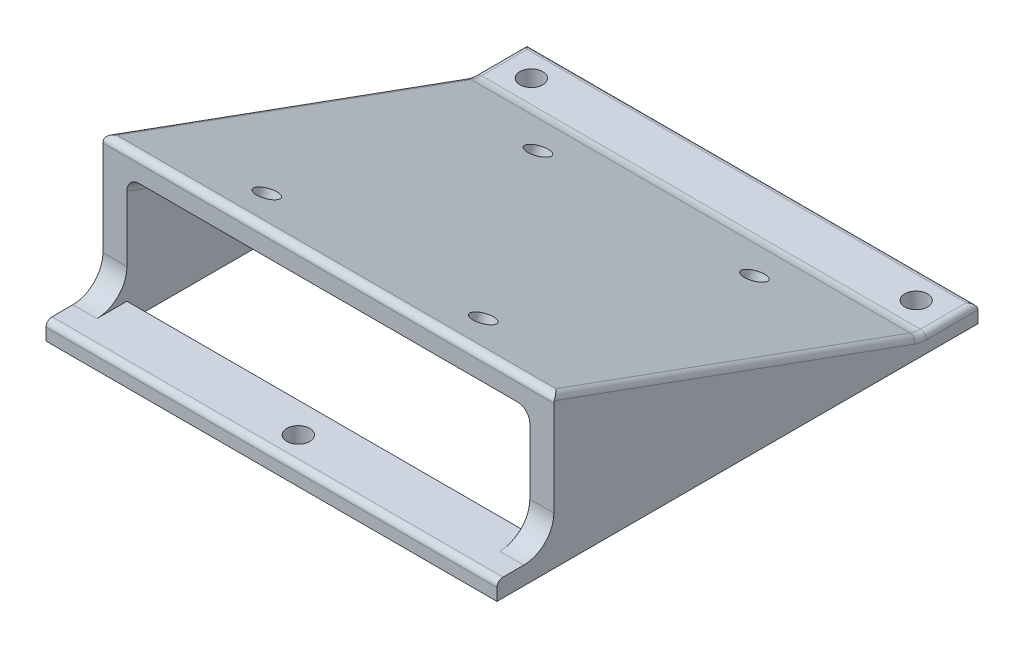
ISO-10303-21;
HEADER;
FILE_DESCRIPTION(('STEP AP214'),'2;1');
FILE_NAME('part.step','',(''),(''),'','','');
FILE_SCHEMA(('AUTOMOTIVE_DESIGN { 1 0 10303 214 1 1 1 1 }'));
ENDSEC;
DATA;
#1=APPLICATION_CONTEXT('core data for automotive mechanical design processes');
#2=APPLICATION_PROTOCOL_DEFINITION('international standard','automotive_design',2000,#1);
#3=PRODUCT_CONTEXT('',#1,'mechanical');
#4=PRODUCT('Part','Part','',(#3));
#5=PRODUCT_RELATED_PRODUCT_CATEGORY('part','',(#4));
#6=PRODUCT_DEFINITION_FORMATION('','',#4);
#7=PRODUCT_DEFINITION_CONTEXT('part definition',#1,'design');
#8=PRODUCT_DEFINITION('design','',#6,#7);
#9=PRODUCT_DEFINITION_SHAPE('','',#8);
#10=(LENGTH_UNIT() NAMED_UNIT(*) SI_UNIT(.MILLI.,.METRE.));
#11=(NAMED_UNIT(*) PLANE_ANGLE_UNIT() SI_UNIT($,.RADIAN.));
#12=(NAMED_UNIT(*) SI_UNIT($,.STERADIAN.) SOLID_ANGLE_UNIT());
#13=UNCERTAINTY_MEASURE_WITH_UNIT(LENGTH_MEASURE(1.E-05),#10,'distance_accuracy_value','');
#14=(GEOMETRIC_REPRESENTATION_CONTEXT(3) GLOBAL_UNCERTAINTY_ASSIGNED_CONTEXT((#13)) GLOBAL_UNIT_ASSIGNED_CONTEXT((#10,
#11,#12)) REPRESENTATION_CONTEXT('',''));
#15=CARTESIAN_POINT('',(0.,0.,0.));
#16=DIRECTION('',(0.,0.,1.));
#17=DIRECTION('',(1.,0.,0.));
#18=AXIS2_PLACEMENT_3D('',#15,#16,#17);
#19=CARTESIAN_POINT('',(37.5,0.,80.));
#20=DIRECTION('',(0.,0.,1.));
#21=DIRECTION('',(1.,0.,0.));
#22=AXIS2_PLACEMENT_3D('',#19,#20,#21);
#23=PLANE('',#22);
#24=DIRECTION('',(0.,1.,0.));
#25=VECTOR('',#24,1.);
#26=CARTESIAN_POINT('',(-37.5,0.,80.));
#27=LINE('',#26,#25);
#28=CARTESIAN_POINT('',(-37.5,27.,80.));
#29=VERTEX_POINT('',#28);
#30=CARTESIAN_POINT('',(-37.5,29.,80.));
#31=VERTEX_POINT('',#30);
#32=EDGE_CURVE('E238',#29,#31,#27,.T.);
#33=ORIENTED_EDGE('',*,*,#32,.F.);
#34=DIRECTION('',(1.,0.,0.));
#35=VECTOR('',#34,1.);
#36=CARTESIAN_POINT('',(-37.5,27.,80.));
#37=LINE('',#36,#35);
#38=CARTESIAN_POINT('',(37.5,27.,80.));
#39=VERTEX_POINT('',#38);
#40=EDGE_CURVE('E64',#29,#39,#37,.T.);
#41=ORIENTED_EDGE('',*,*,#40,.T.);
#42=DIRECTION('',(0.,1.,0.));
#43=VECTOR('',#42,1.);
#44=CARTESIAN_POINT('',(37.5,0.,80.));
#45=LINE('',#44,#43);
#46=CARTESIAN_POINT('',(37.5,29.,80.));
#47=VERTEX_POINT('',#46);
#48=EDGE_CURVE('E216',#39,#47,#45,.T.);
#49=ORIENTED_EDGE('',*,*,#48,.T.);
#50=DIRECTION('',(-1.,0.,0.));
#51=VECTOR('',#50,1.);
#52=CARTESIAN_POINT('',(-37.5,29.,80.));
#53=LINE('',#52,#51);
#54=EDGE_CURVE('E329',#47,#31,#53,.T.);
#55=ORIENTED_EDGE('',*,*,#54,.T.);
#56=EDGE_LOOP('',(#33,#41,#49,#55));
#57=FACE_BOUND('',#56,.T.);
#58=ADVANCED_FACE('F49',(#57),#23,.T.);
#59=CARTESIAN_POINT('',(37.5,0.,0.));
#60=DIRECTION('',(0.,0.,1.));
#61=DIRECTION('',(1.,0.,0.));
#62=AXIS2_PLACEMENT_3D('',#59,#60,#61);
#63=PLANE('',#62);
#64=DIRECTION('',(1.,0.,0.));
#65=VECTOR('',#64,1.);
#66=CARTESIAN_POINT('',(-37.5,27.,0.));
#67=LINE('',#66,#65);
#68=CARTESIAN_POINT('',(-37.5,27.,0.));
#69=VERTEX_POINT('',#68);
#70=CARTESIAN_POINT('',(37.5,27.,0.));
#71=VERTEX_POINT('',#70);
#72=EDGE_CURVE('E201',#69,#71,#67,.T.);
#73=ORIENTED_EDGE('',*,*,#72,.F.);
#74=DIRECTION('',(0.,1.,0.));
#75=VECTOR('',#74,1.);
#76=CARTESIAN_POINT('',(-37.5,0.,0.));
#77=LINE('',#76,#75);
#78=CARTESIAN_POINT('',(-37.5,29.,0.));
#79=VERTEX_POINT('',#78);
#80=EDGE_CURVE('E240',#69,#79,#77,.T.);
#81=ORIENTED_EDGE('',*,*,#80,.T.);
#82=DIRECTION('',(-1.,0.,0.));
#83=VECTOR('',#82,1.);
#84=CARTESIAN_POINT('',(37.5,29.,0.));
#85=LINE('',#84,#83);
#86=CARTESIAN_POINT('',(37.5,29.,0.));
#87=VERTEX_POINT('',#86);
#88=EDGE_CURVE('E221',#79,#87,#85,.F.);
#89=ORIENTED_EDGE('',*,*,#88,.T.);
#90=DIRECTION('',(0.,1.,0.));
#91=VECTOR('',#90,1.);
#92=CARTESIAN_POINT('',(37.5,0.,0.));
#93=LINE('',#92,#91);
#94=EDGE_CURVE('E213',#71,#87,#93,.T.);
#95=ORIENTED_EDGE('',*,*,#94,.F.);
#96=EDGE_LOOP('',(#73,#81,#89,#95));
#97=FACE_BOUND('',#96,.T.);
#98=ADVANCED_FACE('F219',(#97),#63,.F.);
#99=CARTESIAN_POINT('',(37.5,0.,0.));
#100=DIRECTION('',(1.,0.,0.));
#101=DIRECTION('',(0.,0.,-1.));
#102=AXIS2_PLACEMENT_3D('',#99,#100,#101);
#103=PLANE('',#102);
#104=ORIENTED_EDGE('',*,*,#48,.F.);
#105=DIRECTION('',(0.,0.,-1.));
#106=VECTOR('',#105,1.);
#107=CARTESIAN_POINT('',(37.5,27.,0.));
#108=LINE('',#107,#106);
#109=EDGE_CURVE('E204',#39,#71,#108,.T.);
#110=ORIENTED_EDGE('',*,*,#109,.T.);
#111=ORIENTED_EDGE('',*,*,#94,.T.);
#112=DIRECTION('',(0.,0.,1.));
#113=VECTOR('',#112,1.);
#114=CARTESIAN_POINT('',(37.5,29.,8.57835492091559));
#115=LINE('',#114,#113);
#116=CARTESIAN_POINT('',(37.5,29.,8.57835492091559));
#117=VERTEX_POINT('',#116);
#118=EDGE_CURVE('E319',#87,#117,#115,.T.);
#119=ORIENTED_EDGE('',*,*,#118,.T.);
#120=CARTESIAN_POINT('',(37.5,35.,8.57835492091559));
#121=DIRECTION('',(1.,0.,0.));
#122=DIRECTION('',(0.,0.,-1.));
#123=AXIS2_PLACEMENT_3D('',#120,#121,#122);
#124=CIRCLE('',#123,6.);
#125=CARTESIAN_POINT('',(37.5,29.3618442752845,10.6304757808696));
#126=VERTEX_POINT('',#125);
#127=EDGE_CURVE('E317',#117,#126,#124,.F.);
#128=ORIENTED_EDGE('',*,*,#127,.T.);
#129=DIRECTION('',(0.,-0.342020143325663,-0.939692620785911));
#130=VECTOR('',#129,1.);
#131=CARTESIAN_POINT('',(37.5,22.5105919025378,-8.1931854082374));
#132=LINE('',#131,#130);
#133=CARTESIAN_POINT('',(37.5,51.1451814527517,70.479702796328));
#134=VERTEX_POINT('',#133);
#135=EDGE_CURVE('E313',#126,#134,#132,.F.);
#136=ORIENTED_EDGE('',*,*,#135,.T.);
#137=CARTESIAN_POINT('',(37.5,50.803161309426,69.5400101755421));
#138=DIRECTION('',(1.,0.,0.));
#139=DIRECTION('',(0.,0.,-1.));
#140=AXIS2_PLACEMENT_3D('',#137,#138,#139);
#141=CIRCLE('',#140,1.);
#142=CARTESIAN_POINT('',(37.5,50.803161309426,70.5400101755421));
#143=VERTEX_POINT('',#142);
#144=EDGE_CURVE('E315',#134,#143,#141,.T.);
#145=ORIENTED_EDGE('',*,*,#144,.T.);
#146=DIRECTION('',(0.,-1.,0.));
#147=VECTOR('',#146,1.);
#148=CARTESIAN_POINT('',(37.5,0.,70.5400101755421));
#149=LINE('',#148,#147);
#150=CARTESIAN_POINT('',(37.5,35.,70.5400101755421));
#151=VERTEX_POINT('',#150);
#152=EDGE_CURVE('E241',#143,#151,#149,.T.);
#153=ORIENTED_EDGE('',*,*,#152,.T.);
#154=CARTESIAN_POINT('',(37.5,35.,75.5400101755421));
#155=DIRECTION('',(1.,0.,0.));
#156=DIRECTION('',(0.,0.,-1.));
#157=AXIS2_PLACEMENT_3D('',#154,#155,#156);
#158=CIRCLE('',#157,5.);
#159=CARTESIAN_POINT('',(37.5,30.,75.5400101755421));
#160=VERTEX_POINT('',#159);
#161=EDGE_CURVE('E268',#151,#160,#158,.F.);
#162=ORIENTED_EDGE('',*,*,#161,.T.);
#163=DIRECTION('',(0.,0.,1.));
#164=VECTOR('',#163,1.);
#165=CARTESIAN_POINT('',(37.5,30.,0.));
#166=LINE('',#165,#164);
#167=CARTESIAN_POINT('',(37.5,30.,79.));
#168=VERTEX_POINT('',#167);
#169=EDGE_CURVE('E228',#160,#168,#166,.T.);
#170=ORIENTED_EDGE('',*,*,#169,.T.);
#171=CARTESIAN_POINT('',(37.5,29.,79.));
#172=DIRECTION('',(1.,0.,0.));
#173=DIRECTION('',(0.,0.,-1.));
#174=AXIS2_PLACEMENT_3D('',#171,#172,#173);
#175=CIRCLE('',#174,1.);
#176=EDGE_CURVE('E311',#168,#47,#175,.T.);
#177=ORIENTED_EDGE('',*,*,#176,.T.);
#178=EDGE_LOOP('',(#104,#110,#111,#119,#128,#136,#145,#153,#162,#170,#177));
#179=FACE_BOUND('',#178,.T.);
#180=ADVANCED_FACE('F212',(#179),#103,.T.);
#181=CARTESIAN_POINT('',(-37.5,0.,0.));
#182=DIRECTION('',(1.,0.,0.));
#183=DIRECTION('',(0.,0.,-1.));
#184=AXIS2_PLACEMENT_3D('',#181,#182,#183);
#185=PLANE('',#184);
#186=DIRECTION('',(0.,0.,-1.));
#187=VECTOR('',#186,1.);
#188=CARTESIAN_POINT('',(-37.5,27.,0.));
#189=LINE('',#188,#187);
#190=EDGE_CURVE('E205',#29,#69,#189,.T.);
#191=ORIENTED_EDGE('',*,*,#190,.F.);
#192=ORIENTED_EDGE('',*,*,#32,.T.);
#193=CARTESIAN_POINT('',(-37.5,29.,79.));
#194=DIRECTION('',(1.,0.,0.));
#195=DIRECTION('',(0.,0.,-1.));
#196=AXIS2_PLACEMENT_3D('',#193,#194,#195);
#197=CIRCLE('',#196,1.);
#198=CARTESIAN_POINT('',(-37.5,30.,79.));
#199=VERTEX_POINT('',#198);
#200=EDGE_CURVE('E296',#31,#199,#197,.F.);
#201=ORIENTED_EDGE('',*,*,#200,.T.);
#202=DIRECTION('',(0.,0.,1.));
#203=VECTOR('',#202,1.);
#204=CARTESIAN_POINT('',(-37.5,30.,0.));
#205=LINE('',#204,#203);
#206=CARTESIAN_POINT('',(-37.5,30.,75.5400101755421));
#207=VERTEX_POINT('',#206);
#208=EDGE_CURVE('E234',#207,#199,#205,.T.);
#209=ORIENTED_EDGE('',*,*,#208,.F.);
#210=CARTESIAN_POINT('',(-37.5,35.,75.5400101755421));
#211=DIRECTION('',(1.,0.,0.));
#212=DIRECTION('',(0.,0.,-1.));
#213=AXIS2_PLACEMENT_3D('',#210,#211,#212);
#214=CIRCLE('',#213,5.);
#215=CARTESIAN_POINT('',(-37.5,35.,70.5400101755421));
#216=VERTEX_POINT('',#215);
#217=EDGE_CURVE('E270',#207,#216,#214,.T.);
#218=ORIENTED_EDGE('',*,*,#217,.T.);
#219=DIRECTION('',(0.,-1.,0.));
#220=VECTOR('',#219,1.);
#221=CARTESIAN_POINT('',(-37.5,0.,70.5400101755421));
#222=LINE('',#221,#220);
#223=CARTESIAN_POINT('',(-37.5,50.803161309426,70.5400101755421));
#224=VERTEX_POINT('',#223);
#225=EDGE_CURVE('E232',#224,#216,#222,.T.);
#226=ORIENTED_EDGE('',*,*,#225,.F.);
#227=CARTESIAN_POINT('',(-37.5,50.803161309426,69.5400101755421));
#228=DIRECTION('',(1.,0.,0.));
#229=DIRECTION('',(0.,0.,-1.));
#230=AXIS2_PLACEMENT_3D('',#227,#228,#229);
#231=CIRCLE('',#230,1.);
#232=CARTESIAN_POINT('',(-37.5,51.1451814527517,70.479702796328));
#233=VERTEX_POINT('',#232);
#234=EDGE_CURVE('E298',#224,#233,#231,.F.);
#235=ORIENTED_EDGE('',*,*,#234,.T.);
#236=DIRECTION('',(0.,-0.342020143325663,-0.939692620785911));
#237=VECTOR('',#236,1.);
#238=CARTESIAN_POINT('',(-37.5,29.3618442752845,10.6304757808696));
#239=LINE('',#238,#237);
#240=CARTESIAN_POINT('',(-37.5,29.3618442752845,10.6304757808696));
#241=VERTEX_POINT('',#240);
#242=EDGE_CURVE('E300',#233,#241,#239,.T.);
#243=ORIENTED_EDGE('',*,*,#242,.T.);
#244=CARTESIAN_POINT('',(-37.5,35.,8.57835492091559));
#245=DIRECTION('',(1.,0.,0.));
#246=DIRECTION('',(0.,0.,-1.));
#247=AXIS2_PLACEMENT_3D('',#244,#245,#246);
#248=CIRCLE('',#247,6.);
#249=CARTESIAN_POINT('',(-37.5,29.,8.57835492091559));
#250=VERTEX_POINT('',#249);
#251=EDGE_CURVE('E302',#241,#250,#248,.T.);
#252=ORIENTED_EDGE('',*,*,#251,.T.);
#253=DIRECTION('',(0.,0.,1.));
#254=VECTOR('',#253,1.);
#255=CARTESIAN_POINT('',(-37.5,29.,0.));
#256=LINE('',#255,#254);
#257=EDGE_CURVE('E304',#250,#79,#256,.F.);
#258=ORIENTED_EDGE('',*,*,#257,.T.);
#259=ORIENTED_EDGE('',*,*,#80,.F.);
#260=EDGE_LOOP('',(#191,#192,#201,#209,#218,#226,#235,#243,#252,#258,#259));
#261=FACE_BOUND('',#260,.T.);
#262=ADVANCED_FACE('F489',(#261),#185,.F.);
#263=CARTESIAN_POINT('',(37.5,0.,70.5400101755421));
#264=DIRECTION('',(0.,0.,-1.));
#265=DIRECTION('',(-1.,0.,0.));
#266=AXIS2_PLACEMENT_3D('',#263,#264,#265);
#267=PLANE('',#266);
#268=DIRECTION('',(0.,-1.,0.));
#269=VECTOR('',#268,1.);
#270=CARTESIAN_POINT('',(33.5,0.,70.5400101755421));
#271=LINE('',#270,#269);
#272=CARTESIAN_POINT('',(33.5,30.,70.5400101755421));
#273=VERTEX_POINT('',#272);
#274=CARTESIAN_POINT('',(33.5,27.,70.5400101755421));
#275=VERTEX_POINT('',#274);
#276=EDGE_CURVE('E392',#273,#275,#271,.T.);
#277=ORIENTED_EDGE('',*,*,#276,.T.);
#278=DIRECTION('',(-1.,0.,0.));
#279=VECTOR('',#278,1.);
#280=CARTESIAN_POINT('',(37.5,27.,70.5400101755421));
#281=LINE('',#280,#279);
#282=CARTESIAN_POINT('',(-33.5,27.,70.5400101755421));
#283=VERTEX_POINT('',#282);
#284=EDGE_CURVE('E409',#275,#283,#281,.T.);
#285=ORIENTED_EDGE('',*,*,#284,.T.);
#286=DIRECTION('',(0.,-1.,0.));
#287=VECTOR('',#286,1.);
#288=CARTESIAN_POINT('',(-33.5,0.,70.5400101755421));
#289=LINE('',#288,#287);
#290=CARTESIAN_POINT('',(-33.5,30.,70.5400101755421));
#291=VERTEX_POINT('',#290);
#292=EDGE_CURVE('E358',#291,#283,#289,.T.);
#293=ORIENTED_EDGE('',*,*,#292,.F.);
#294=DIRECTION('',(-1.,0.,0.));
#295=VECTOR('',#294,1.);
#296=CARTESIAN_POINT('',(37.5,30.,70.5400101755421));
#297=LINE('',#296,#295);
#298=EDGE_CURVE('E223',#273,#291,#297,.T.);
#299=ORIENTED_EDGE('',*,*,#298,.F.);
#300=EDGE_LOOP('',(#277,#285,#293,#299));
#301=FACE_BOUND('',#300,.T.);
#302=ADVANCED_FACE('F457',(#301),#267,.T.);
#303=CARTESIAN_POINT('',(37.5,19.69151404018,-7.16712497826041));
#304=DIRECTION('',(0.,0.939692620785911,-0.342020143325663));
#305=DIRECTION('',(0.,0.342020143325663,0.939692620785911));
#306=AXIS2_PLACEMENT_3D('',#303,#304,#305);
#307=PLANE('',#306);
#308=CARTESIAN_POINT('',(18.0000000001173,45.6511059144536,64.1562675145651));
#309=DIRECTION('',(0.,-0.93969262078591,0.342020143325663));
#310=DIRECTION('',(0.,-0.342020143325663,-0.93969262078591));
#311=AXIS2_PLACEMENT_3D('',#308,#309,#310);
#312=CIRCLE('',#311,1.8);
#313=CARTESIAN_POINT('',(18.0000000001173,45.0354696564674,62.4648207971504));
#314=VERTEX_POINT('',#313);
#315=EDGE_CURVE('E431',#314,#314,#312,.T.);
#316=ORIENTED_EDGE('',*,*,#315,.F.);
#317=EDGE_LOOP('',(#316));
#318=FACE_BOUND('',#317,.T.);
#319=CARTESIAN_POINT('',(-17.9999999998827,29.2341390348217,19.0510217168414));
#320=DIRECTION('',(0.,-0.93969262078591,0.342020143325663));
#321=DIRECTION('',(0.,-0.342020143325663,-0.93969262078591));
#322=AXIS2_PLACEMENT_3D('',#319,#320,#321);
#323=CIRCLE('',#322,1.8);
#324=CARTESIAN_POINT('',(-17.9999999998827,28.6185027768355,17.3595749994267));
#325=VERTEX_POINT('',#324);
#326=EDGE_CURVE('E424',#325,#325,#323,.T.);
#327=ORIENTED_EDGE('',*,*,#326,.F.);
#328=EDGE_LOOP('',(#327));
#329=FACE_BOUND('',#328,.T.);
#330=CARTESIAN_POINT('',(18.0000000001173,29.2341390348217,19.0510217168414));
#331=DIRECTION('',(0.,-0.93969262078591,0.342020143325663));
#332=DIRECTION('',(0.,-0.342020143325663,-0.93969262078591));
#333=AXIS2_PLACEMENT_3D('',#330,#331,#332);
#334=CIRCLE('',#333,1.8);
#335=CARTESIAN_POINT('',(18.0000000001173,28.6185027768355,17.3595749994267));
#336=VERTEX_POINT('',#335);
#337=EDGE_CURVE('E436',#336,#336,#334,.T.);
#338=ORIENTED_EDGE('',*,*,#337,.F.);
#339=EDGE_LOOP('',(#338));
#340=FACE_BOUND('',#339,.T.);
#341=CARTESIAN_POINT('',(-17.9999999998827,45.6511059144536,64.1562675145651));
#342=DIRECTION('',(0.,-0.93969262078591,0.342020143325663));
#343=DIRECTION('',(0.,-0.342020143325663,-0.93969262078591));
#344=AXIS2_PLACEMENT_3D('',#341,#342,#343);
#345=CIRCLE('',#344,1.8);
#346=CARTESIAN_POINT('',(-17.9999999998827,45.0354696564674,62.4648207971504));
#347=VERTEX_POINT('',#346);
#348=EDGE_CURVE('E217',#347,#347,#345,.T.);
#349=ORIENTED_EDGE('',*,*,#348,.F.);
#350=EDGE_LOOP('',(#349));
#351=FACE_BOUND('',#350,.T.);
#352=DIRECTION('',(-1.,0.,0.));
#353=VECTOR('',#352,1.);
#354=CARTESIAN_POINT('',(37.5,27.,12.9127751667464));
#355=LINE('',#354,#353);
#356=CARTESIAN_POINT('',(31.5,27.,12.9127751667464));
#357=VERTEX_POINT('',#356);
#358=CARTESIAN_POINT('',(-31.5,27.,12.9127751667464));
#359=VERTEX_POINT('',#358);
#360=EDGE_CURVE('E71',#357,#359,#355,.T.);
#361=ORIENTED_EDGE('',*,*,#360,.F.);
#362=DIRECTION('',(0.,-0.342020143325663,-0.939692620785911));
#363=VECTOR('',#362,1.);
#364=CARTESIAN_POINT('',(31.5,47.9745982262645,70.5400101755421));
#365=LINE('',#364,#363);
#366=CARTESIAN_POINT('',(31.5,47.9745982262645,70.5400101755421));
#367=VERTEX_POINT('',#366);
#368=EDGE_CURVE('E281',#357,#367,#365,.F.);
#369=ORIENTED_EDGE('',*,*,#368,.T.);
#370=DIRECTION('',(-1.,0.,0.));
#371=VECTOR('',#370,1.);
#372=CARTESIAN_POINT('',(37.5,47.9745982262645,70.5400101755421));
#373=LINE('',#372,#371);
#374=CARTESIAN_POINT('',(-31.5,47.9745982262645,70.5400101755421));
#375=VERTEX_POINT('',#374);
#376=EDGE_CURVE('E235',#367,#375,#373,.T.);
#377=ORIENTED_EDGE('',*,*,#376,.T.);
#378=DIRECTION('',(0.,-0.342020143325663,-0.939692620785911));
#379=VECTOR('',#378,1.);
#380=CARTESIAN_POINT('',(-31.5,19.69151404018,-7.16712497826041));
#381=LINE('',#380,#379);
#382=EDGE_CURVE('E278',#375,#359,#381,.T.);
#383=ORIENTED_EDGE('',*,*,#382,.T.);
#384=EDGE_LOOP('',(#361,#369,#377,#383));
#385=FACE_BOUND('',#384,.T.);
#386=ADVANCED_FACE('F453',(#318,#329,#340,#351,#385),#307,.F.);
#387=CARTESIAN_POINT('',(33.5,0.,0.));
#388=DIRECTION('',(1.,0.,0.));
#389=DIRECTION('',(0.,0.,-1.));
#390=AXIS2_PLACEMENT_3D('',#387,#388,#389);
#391=PLANE('',#390);
#392=DIRECTION('',(0.,0.,-1.));
#393=VECTOR('',#392,1.);
#394=CARTESIAN_POINT('',(33.5,27.,0.));
#395=LINE('',#394,#393);
#396=CARTESIAN_POINT('',(33.5,27.,18.7603839670727));
#397=VERTEX_POINT('',#396);
#398=EDGE_CURVE('E401',#275,#397,#395,.T.);
#399=ORIENTED_EDGE('',*,*,#398,.F.);
#400=ORIENTED_EDGE('',*,*,#276,.F.);
#401=DIRECTION('',(0.,0.,-1.));
#402=VECTOR('',#401,1.);
#403=CARTESIAN_POINT('',(33.5,30.,0.));
#404=LINE('',#403,#402);
#405=CARTESIAN_POINT('',(33.5,30.,75.5400101755421));
#406=VERTEX_POINT('',#405);
#407=EDGE_CURVE('E254',#406,#273,#404,.T.);
#408=ORIENTED_EDGE('',*,*,#407,.F.);
#409=CARTESIAN_POINT('',(33.5,35.,75.5400101755421));
#410=DIRECTION('',(1.,0.,0.));
#411=DIRECTION('',(0.,0.,-1.));
#412=AXIS2_PLACEMENT_3D('',#409,#410,#411);
#413=CIRCLE('',#412,5.);
#414=CARTESIAN_POINT('',(33.5,35.,70.5400101755421));
#415=VERTEX_POINT('',#414);
#416=EDGE_CURVE('E265',#406,#415,#413,.T.);
#417=ORIENTED_EDGE('',*,*,#416,.T.);
#418=CARTESIAN_POINT('',(33.5,45.8462426813126,70.5400101755421));
#419=VERTEX_POINT('',#418);
#420=EDGE_CURVE('E395',#419,#415,#271,.T.);
#421=ORIENTED_EDGE('',*,*,#420,.F.);
#422=DIRECTION('',(0.,-0.342020143325663,-0.939692620785911));
#423=VECTOR('',#422,1.);
#424=CARTESIAN_POINT('',(33.5,22.6045703615579,6.68404028665133));
#425=LINE('',#424,#423);
#426=EDGE_CURVE('E275',#419,#397,#425,.T.);
#427=ORIENTED_EDGE('',*,*,#426,.T.);
#428=EDGE_LOOP('',(#399,#400,#408,#417,#421,#427));
#429=FACE_BOUND('',#428,.T.);
#430=ADVANCED_FACE('F456',(#429),#391,.F.);
#431=CARTESIAN_POINT('',(-33.5,0.,0.));
#432=DIRECTION('',(1.,0.,0.));
#433=DIRECTION('',(0.,0.,-1.));
#434=AXIS2_PLACEMENT_3D('',#431,#432,#433);
#435=PLANE('',#434);
#436=ORIENTED_EDGE('',*,*,#292,.T.);
#437=DIRECTION('',(0.,0.,-1.));
#438=VECTOR('',#437,1.);
#439=CARTESIAN_POINT('',(-33.5,27.,0.));
#440=LINE('',#439,#438);
#441=CARTESIAN_POINT('',(-33.5,27.,18.7603839670727));
#442=VERTEX_POINT('',#441);
#443=EDGE_CURVE('E413',#283,#442,#440,.T.);
#444=ORIENTED_EDGE('',*,*,#443,.T.);
#445=DIRECTION('',(0.,-0.342020143325663,-0.939692620785911));
#446=VECTOR('',#445,1.);
#447=CARTESIAN_POINT('',(-33.5,17.8121287986082,-6.48308469160909));
#448=LINE('',#447,#446);
#449=CARTESIAN_POINT('',(-33.5,45.8462426813126,70.5400101755421));
#450=VERTEX_POINT('',#449);
#451=EDGE_CURVE('E283',#442,#450,#448,.F.);
#452=ORIENTED_EDGE('',*,*,#451,.T.);
#453=CARTESIAN_POINT('',(-33.5,35.,70.5400101755421));
#454=VERTEX_POINT('',#453);
#455=EDGE_CURVE('E390',#450,#454,#289,.T.);
#456=ORIENTED_EDGE('',*,*,#455,.T.);
#457=CARTESIAN_POINT('',(-33.5,35.,75.5400101755421));
#458=DIRECTION('',(1.,0.,0.));
#459=DIRECTION('',(0.,0.,-1.));
#460=AXIS2_PLACEMENT_3D('',#457,#458,#459);
#461=CIRCLE('',#460,5.);
#462=CARTESIAN_POINT('',(-33.5,30.,75.5400101755421));
#463=VERTEX_POINT('',#462);
#464=EDGE_CURVE('E273',#454,#463,#461,.F.);
#465=ORIENTED_EDGE('',*,*,#464,.T.);
#466=DIRECTION('',(0.,0.,1.));
#467=VECTOR('',#466,1.);
#468=CARTESIAN_POINT('',(-33.5,30.,0.));
#469=LINE('',#468,#467);
#470=EDGE_CURVE('E248',#291,#463,#469,.T.);
#471=ORIENTED_EDGE('',*,*,#470,.F.);
#472=EDGE_LOOP('',(#436,#444,#452,#456,#465,#471));
#473=FACE_BOUND('',#472,.T.);
#474=ADVANCED_FACE('F499',(#473),#435,.T.);
#475=CARTESIAN_POINT('',(31.5,17.8121287986082,-6.48308469160908));
#476=DIRECTION('',(0.,0.342020143325663,0.939692620785911));
#477=DIRECTION('',(0.,-0.939692620785911,0.342020143325663));
#478=AXIS2_PLACEMENT_3D('',#475,#476,#477);
#479=CYLINDRICAL_SURFACE('',#478,2.);
#480=CARTESIAN_POINT('',(31.5,27.,18.7603839670727));
#481=DIRECTION('',(0.,-1.,0.));
#482=DIRECTION('',(0.,0.,1.));
#483=AXIS2_PLACEMENT_3D('',#480,#481,#482);
#484=ELLIPSE('',#483,5.84760880032627,2.);
#485=EDGE_CURVE('E407',#397,#357,#484,.F.);
#486=ORIENTED_EDGE('',*,*,#485,.F.);
#487=ORIENTED_EDGE('',*,*,#426,.F.);
#488=CARTESIAN_POINT('',(31.5,45.8462426813126,70.5400101755421));
#489=DIRECTION('',(0.,0.,-1.));
#490=DIRECTION('',(0.,1.,0.));
#491=AXIS2_PLACEMENT_3D('',#488,#489,#490);
#492=ELLIPSE('',#491,2.12835554495182,2.);
#493=EDGE_CURVE('E285',#367,#419,#492,.T.);
#494=ORIENTED_EDGE('',*,*,#493,.F.);
#495=ORIENTED_EDGE('',*,*,#368,.F.);
#496=EDGE_LOOP('',(#486,#487,#494,#495));
#497=FACE_BOUND('',#496,.T.);
#498=ADVANCED_FACE('F468',(#497),#479,.F.);
#499=CARTESIAN_POINT('',(-31.5,17.8121287986082,-6.48308469160908));
#500=DIRECTION('',(0.,-0.342020143325663,-0.939692620785911));
#501=DIRECTION('',(0.,0.939692620785911,-0.342020143325663));
#502=AXIS2_PLACEMENT_3D('',#499,#500,#501);
#503=CYLINDRICAL_SURFACE('',#502,2.);
#504=CARTESIAN_POINT('',(-31.5,27.,18.7603839670727));
#505=DIRECTION('',(0.,-1.,0.));
#506=DIRECTION('',(0.,0.,-1.));
#507=AXIS2_PLACEMENT_3D('',#504,#505,#506);
#508=ELLIPSE('',#507,5.84760880032627,2.);
#509=EDGE_CURVE('E11',#359,#442,#508,.F.);
#510=ORIENTED_EDGE('',*,*,#509,.F.);
#511=ORIENTED_EDGE('',*,*,#382,.F.);
#512=CARTESIAN_POINT('',(-31.5,45.8462426813126,70.5400101755421));
#513=DIRECTION('',(0.,0.,-1.));
#514=DIRECTION('',(0.,-1.,0.));
#515=AXIS2_PLACEMENT_3D('',#512,#513,#514);
#516=ELLIPSE('',#515,2.12835554495182,2.);
#517=EDGE_CURVE('E287',#450,#375,#516,.T.);
#518=ORIENTED_EDGE('',*,*,#517,.F.);
#519=ORIENTED_EDGE('',*,*,#451,.F.);
#520=EDGE_LOOP('',(#510,#511,#518,#519));
#521=FACE_BOUND('',#520,.T.);
#522=ADVANCED_FACE('F506',(#521),#503,.F.);
#523=CARTESIAN_POINT('',(37.5,0.,70.5400101755421));
#524=DIRECTION('',(0.,0.,-1.));
#525=DIRECTION('',(-1.,0.,0.));
#526=AXIS2_PLACEMENT_3D('',#523,#524,#525);
#527=PLANE('',#526);
#528=ORIENTED_EDGE('',*,*,#152,.F.);
#529=DIRECTION('',(-1.,0.,0.));
#530=VECTOR('',#529,1.);
#531=CARTESIAN_POINT('',(-37.5,50.803161309426,70.5400101755421));
#532=LINE('',#531,#530);
#533=EDGE_CURVE('E327',#143,#224,#532,.T.);
#534=ORIENTED_EDGE('',*,*,#533,.T.);
#535=ORIENTED_EDGE('',*,*,#225,.T.);
#536=DIRECTION('',(-1.,0.,0.));
#537=VECTOR('',#536,1.);
#538=CARTESIAN_POINT('',(-33.5,35.,70.5400101755421));
#539=LINE('',#538,#537);
#540=EDGE_CURVE('E259',#216,#454,#539,.F.);
#541=ORIENTED_EDGE('',*,*,#540,.T.);
#542=ORIENTED_EDGE('',*,*,#455,.F.);
#543=ORIENTED_EDGE('',*,*,#517,.T.);
#544=ORIENTED_EDGE('',*,*,#376,.F.);
#545=ORIENTED_EDGE('',*,*,#493,.T.);
#546=ORIENTED_EDGE('',*,*,#420,.T.);
#547=DIRECTION('',(-1.,0.,0.));
#548=VECTOR('',#547,1.);
#549=CARTESIAN_POINT('',(37.5,35.,70.5400101755421));
#550=LINE('',#549,#548);
#551=EDGE_CURVE('E262',#415,#151,#550,.F.);
#552=ORIENTED_EDGE('',*,*,#551,.T.);
#553=EDGE_LOOP('',(#528,#534,#535,#541,#542,#543,#544,#545,#546,#552));
#554=FACE_BOUND('',#553,.T.);
#555=ADVANCED_FACE('F374',(#554),#527,.F.);
#556=CARTESIAN_POINT('',(37.5,30.,0.));
#557=DIRECTION('',(0.,-1.,0.));
#558=DIRECTION('',(0.,0.,-1.));
#559=AXIS2_PLACEMENT_3D('',#556,#557,#558);
#560=PLANE('',#559);
#561=CARTESIAN_POINT('',(0.,30.,75.5400101755421));
#562=DIRECTION('',(0.,-1.,0.));
#563=DIRECTION('',(0.,0.,-1.));
#564=AXIS2_PLACEMENT_3D('',#561,#562,#563);
#565=CIRCLE('',#564,1.9);
#566=CARTESIAN_POINT('',(0.,30.,73.6400101755421));
#567=VERTEX_POINT('',#566);
#568=EDGE_CURVE('E337',#567,#567,#565,.F.);
#569=ORIENTED_EDGE('',*,*,#568,.F.);
#570=EDGE_LOOP('',(#569));
#571=FACE_BOUND('',#570,.T.);
#572=ORIENTED_EDGE('',*,*,#208,.T.);
#573=DIRECTION('',(-1.,0.,0.));
#574=VECTOR('',#573,1.);
#575=CARTESIAN_POINT('',(37.5,30.,79.));
#576=LINE('',#575,#574);
#577=EDGE_CURVE('E57',#199,#168,#576,.F.);
#578=ORIENTED_EDGE('',*,*,#577,.T.);
#579=ORIENTED_EDGE('',*,*,#169,.F.);
#580=DIRECTION('',(-1.,0.,0.));
#581=VECTOR('',#580,1.);
#582=CARTESIAN_POINT('',(33.5,30.,75.5400101755421));
#583=LINE('',#582,#581);
#584=EDGE_CURVE('E256',#160,#406,#583,.T.);
#585=ORIENTED_EDGE('',*,*,#584,.T.);
#586=ORIENTED_EDGE('',*,*,#407,.T.);
#587=ORIENTED_EDGE('',*,*,#298,.T.);
#588=ORIENTED_EDGE('',*,*,#470,.T.);
#589=DIRECTION('',(-1.,0.,0.));
#590=VECTOR('',#589,1.);
#591=CARTESIAN_POINT('',(-37.5,30.,75.5400101755421));
#592=LINE('',#591,#590);
#593=EDGE_CURVE('E251',#463,#207,#592,.T.);
#594=ORIENTED_EDGE('',*,*,#593,.T.);
#595=EDGE_LOOP('',(#572,#578,#579,#585,#586,#587,#588,#594));
#596=FACE_BOUND('',#595,.T.);
#597=ADVANCED_FACE('F370',(#571,#596),#560,.F.);
#598=CARTESIAN_POINT('',(37.5,30.,0.));
#599=DIRECTION('',(0.,-1.,0.));
#600=DIRECTION('',(0.,0.,-1.));
#601=AXIS2_PLACEMENT_3D('',#598,#599,#600);
#602=PLANE('',#601);
#603=CARTESIAN_POINT('',(-32.,30.,4.7891774604578));
#604=DIRECTION('',(0.,-1.,0.));
#605=DIRECTION('',(0.,0.,-1.));
#606=AXIS2_PLACEMENT_3D('',#603,#604,#605);
#607=CIRCLE('',#606,1.9);
#608=CARTESIAN_POINT('',(-32.,30.,2.88917746045779));
#609=VERTEX_POINT('',#608);
#610=EDGE_CURVE('E362',#609,#609,#607,.F.);
#611=ORIENTED_EDGE('',*,*,#610,.F.);
#612=EDGE_LOOP('',(#611));
#613=FACE_BOUND('',#612,.T.);
#614=CARTESIAN_POINT('',(32.,30.,4.78917746045779));
#615=DIRECTION('',(0.,-1.,0.));
#616=DIRECTION('',(0.,0.,-1.));
#617=AXIS2_PLACEMENT_3D('',#614,#615,#616);
#618=CIRCLE('',#617,1.9);
#619=CARTESIAN_POINT('',(32.,30.,2.88917746045779));
#620=VERTEX_POINT('',#619);
#621=EDGE_CURVE('E359',#620,#620,#618,.F.);
#622=ORIENTED_EDGE('',*,*,#621,.F.);
#623=EDGE_LOOP('',(#622));
#624=FACE_BOUND('',#623,.T.);
#625=DIRECTION('',(-1.,0.,0.));
#626=VECTOR('',#625,1.);
#627=CARTESIAN_POINT('',(37.5,30.,1.));
#628=LINE('',#627,#626);
#629=CARTESIAN_POINT('',(36.5,30.,1.));
#630=VERTEX_POINT('',#629);
#631=CARTESIAN_POINT('',(-36.5,30.,1.));
#632=VERTEX_POINT('',#631);
#633=EDGE_CURVE('E289',#630,#632,#628,.T.);
#634=ORIENTED_EDGE('',*,*,#633,.T.);
#635=DIRECTION('',(0.,0.,1.));
#636=VECTOR('',#635,1.);
#637=CARTESIAN_POINT('',(-36.5,30.,0.));
#638=LINE('',#637,#636);
#639=CARTESIAN_POINT('',(-36.5,30.,8.57835492091559));
#640=VERTEX_POINT('',#639);
#641=EDGE_CURVE('E293',#632,#640,#638,.T.);
#642=ORIENTED_EDGE('',*,*,#641,.T.);
#643=DIRECTION('',(-1.,0.,0.));
#644=VECTOR('',#643,1.);
#645=CARTESIAN_POINT('',(37.5,30.,8.57835492091559));
#646=LINE('',#645,#644);
#647=CARTESIAN_POINT('',(36.5,30.,8.57835492091559));
#648=VERTEX_POINT('',#647);
#649=EDGE_CURVE('E245',#640,#648,#646,.F.);
#650=ORIENTED_EDGE('',*,*,#649,.T.);
#651=DIRECTION('',(0.,0.,1.));
#652=VECTOR('',#651,1.);
#653=CARTESIAN_POINT('',(36.5,30.,0.));
#654=LINE('',#653,#652);
#655=EDGE_CURVE('E291',#648,#630,#654,.F.);
#656=ORIENTED_EDGE('',*,*,#655,.T.);
#657=EDGE_LOOP('',(#634,#642,#650,#656));
#658=FACE_BOUND('',#657,.T.);
#659=ADVANCED_FACE('F373',(#613,#624,#658),#602,.F.);
#660=CARTESIAN_POINT('',(37.5,23.4502845233237,-8.53520555156306));
#661=DIRECTION('',(0.,0.939692620785911,-0.342020143325663));
#662=DIRECTION('',(0.,0.342020143325663,0.939692620785911));
#663=AXIS2_PLACEMENT_3D('',#660,#661,#662);
#664=PLANE('',#663);
#665=CARTESIAN_POINT('',(18.0000000001173,49.4098763975972,62.7881869412624));
#666=DIRECTION('',(0.,0.939692620785911,-0.342020143325663));
#667=DIRECTION('',(0.,0.342020143325663,0.939692620785911));
#668=AXIS2_PLACEMENT_3D('',#665,#666,#667);
#669=CIRCLE('',#668,1.8);
#670=CARTESIAN_POINT('',(18.0000000001173,50.0255126555834,64.4796336586771));
#671=VERTEX_POINT('',#670);
#672=EDGE_CURVE('E421',#671,#671,#669,.F.);
#673=ORIENTED_EDGE('',*,*,#672,.T.);
#674=EDGE_LOOP('',(#673));
#675=FACE_BOUND('',#674,.T.);
#676=CARTESIAN_POINT('',(-17.9999999998827,32.9929095179654,17.6829411435387));
#677=DIRECTION('',(0.,0.939692620785911,-0.342020143325663));
#678=DIRECTION('',(0.,0.342020143325663,0.939692620785911));
#679=AXIS2_PLACEMENT_3D('',#676,#677,#678);
#680=CIRCLE('',#679,1.8);
#681=CARTESIAN_POINT('',(-17.9999999998827,33.6085457759516,19.3743878609534));
#682=VERTEX_POINT('',#681);
#683=EDGE_CURVE('E427',#682,#682,#680,.F.);
#684=ORIENTED_EDGE('',*,*,#683,.T.);
#685=EDGE_LOOP('',(#684));
#686=FACE_BOUND('',#685,.T.);
#687=CARTESIAN_POINT('',(18.0000000001173,32.9929095179654,17.6829411435387));
#688=DIRECTION('',(0.,0.939692620785911,-0.342020143325663));
#689=DIRECTION('',(0.,0.342020143325663,0.939692620785911));
#690=AXIS2_PLACEMENT_3D('',#687,#688,#689);
#691=CIRCLE('',#690,1.8);
#692=CARTESIAN_POINT('',(18.0000000001173,33.6085457759516,19.3743878609534));
#693=VERTEX_POINT('',#692);
#694=EDGE_CURVE('E428',#693,#693,#691,.F.);
#695=ORIENTED_EDGE('',*,*,#694,.T.);
#696=EDGE_LOOP('',(#695));
#697=FACE_BOUND('',#696,.T.);
#698=CARTESIAN_POINT('',(-17.9999999998827,49.4098763975972,62.7881869412624));
#699=DIRECTION('',(0.,0.939692620785911,-0.342020143325663));
#700=DIRECTION('',(0.,0.342020143325663,0.939692620785911));
#701=AXIS2_PLACEMENT_3D('',#698,#699,#700);
#702=CIRCLE('',#701,1.8);
#703=CARTESIAN_POINT('',(-17.9999999998827,50.0255126555834,64.4796336586771));
#704=VERTEX_POINT('',#703);
#705=EDGE_CURVE('E418',#704,#704,#702,.F.);
#706=ORIENTED_EDGE('',*,*,#705,.T.);
#707=EDGE_LOOP('',(#706));
#708=FACE_BOUND('',#707,.T.);
#709=DIRECTION('',(-1.,0.,0.));
#710=VECTOR('',#709,1.);
#711=CARTESIAN_POINT('',(37.5,30.3015368960704,10.2884556375439));
#712=LINE('',#711,#710);
#713=CARTESIAN_POINT('',(36.5,30.3015368960704,10.2884556375439));
#714=VERTEX_POINT('',#713);
#715=CARTESIAN_POINT('',(-36.5,30.3015368960704,10.2884556375439));
#716=VERTEX_POINT('',#715);
#717=EDGE_CURVE('E226',#714,#716,#712,.T.);
#718=ORIENTED_EDGE('',*,*,#717,.T.);
#719=DIRECTION('',(0.,-0.342020143325663,-0.939692620785911));
#720=VECTOR('',#719,1.);
#721=CARTESIAN_POINT('',(-36.5,52.2313093161681,70.5400101755421));
#722=LINE('',#721,#720);
#723=CARTESIAN_POINT('',(-36.5,51.7428539302119,69.1979900322164));
#724=VERTEX_POINT('',#723);
#725=EDGE_CURVE('E325',#716,#724,#722,.F.);
#726=ORIENTED_EDGE('',*,*,#725,.T.);
#727=DIRECTION('',(-1.,0.,0.));
#728=VECTOR('',#727,1.);
#729=CARTESIAN_POINT('',(37.5,51.7428539302119,69.1979900322164));
#730=LINE('',#729,#728);
#731=CARTESIAN_POINT('',(36.5,51.7428539302119,69.1979900322164));
#732=VERTEX_POINT('',#731);
#733=EDGE_CURVE('E323',#724,#732,#730,.F.);
#734=ORIENTED_EDGE('',*,*,#733,.T.);
#735=DIRECTION('',(0.,-0.342020143325663,-0.939692620785911));
#736=VECTOR('',#735,1.);
#737=CARTESIAN_POINT('',(36.5,23.4502845233237,-8.53520555156306));
#738=LINE('',#737,#736);
#739=EDGE_CURVE('E321',#732,#714,#738,.T.);
#740=ORIENTED_EDGE('',*,*,#739,.T.);
#741=EDGE_LOOP('',(#718,#726,#734,#740));
#742=FACE_BOUND('',#741,.T.);
#743=ADVANCED_FACE('F442',(#675,#686,#697,#708,#742),#664,.T.);
#744=CARTESIAN_POINT('',(37.5,35.,8.57835492091559));
#745=DIRECTION('',(-1.,0.,0.));
#746=DIRECTION('',(0.,0.,1.));
#747=AXIS2_PLACEMENT_3D('',#744,#745,#746);
#748=CYLINDRICAL_SURFACE('',#747,5.);
#749=ORIENTED_EDGE('',*,*,#649,.F.);
#750=CARTESIAN_POINT('',(-36.5,35.,8.57835492091559));
#751=DIRECTION('',(1.,0.,0.));
#752=DIRECTION('',(0.,0.,-1.));
#753=AXIS2_PLACEMENT_3D('',#750,#751,#752);
#754=CIRCLE('',#753,5.);
#755=EDGE_CURVE('E309',#640,#716,#754,.F.);
#756=ORIENTED_EDGE('',*,*,#755,.T.);
#757=ORIENTED_EDGE('',*,*,#717,.F.);
#758=CARTESIAN_POINT('',(36.5,35.,8.57835492091559));
#759=DIRECTION('',(1.,0.,0.));
#760=DIRECTION('',(0.,0.,-1.));
#761=AXIS2_PLACEMENT_3D('',#758,#759,#760);
#762=CIRCLE('',#761,5.);
#763=EDGE_CURVE('E307',#714,#648,#762,.T.);
#764=ORIENTED_EDGE('',*,*,#763,.T.);
#765=EDGE_LOOP('',(#749,#756,#757,#764));
#766=FACE_BOUND('',#765,.T.);
#767=ADVANCED_FACE('F545',(#766),#748,.F.);
#768=CARTESIAN_POINT('',(37.5,35.,75.5400101755421));
#769=DIRECTION('',(1.,0.,0.));
#770=DIRECTION('',(0.,0.,-1.));
#771=AXIS2_PLACEMENT_3D('',#768,#769,#770);
#772=CYLINDRICAL_SURFACE('',#771,5.);
#773=ORIENTED_EDGE('',*,*,#161,.F.);
#774=ORIENTED_EDGE('',*,*,#551,.F.);
#775=ORIENTED_EDGE('',*,*,#416,.F.);
#776=ORIENTED_EDGE('',*,*,#584,.F.);
#777=EDGE_LOOP('',(#773,#774,#775,#776));
#778=FACE_BOUND('',#777,.T.);
#779=ADVANCED_FACE('F479',(#778),#772,.F.);
#780=CARTESIAN_POINT('',(37.5,35.,75.5400101755421));
#781=DIRECTION('',(1.,0.,0.));
#782=DIRECTION('',(0.,0.,-1.));
#783=AXIS2_PLACEMENT_3D('',#780,#781,#782);
#784=CYLINDRICAL_SURFACE('',#783,5.);
#785=ORIENTED_EDGE('',*,*,#464,.F.);
#786=ORIENTED_EDGE('',*,*,#540,.F.);
#787=ORIENTED_EDGE('',*,*,#217,.F.);
#788=ORIENTED_EDGE('',*,*,#593,.F.);
#789=EDGE_LOOP('',(#785,#786,#787,#788));
#790=FACE_BOUND('',#789,.T.);
#791=ADVANCED_FACE('F496',(#790),#784,.F.);
#792=CARTESIAN_POINT('',(36.5,22.5105919025378,-8.1931854082374));
#793=DIRECTION('',(0.,-0.342020143325663,-0.939692620785911));
#794=DIRECTION('',(0.,0.939692620785911,-0.342020143325663));
#795=AXIS2_PLACEMENT_3D('',#792,#793,#794);
#796=CYLINDRICAL_SURFACE('',#795,1.);
#797=CARTESIAN_POINT('',(36.5,50.803161309426,69.5400101755421));
#798=DIRECTION('',(0.707106781186547,-0.241844762647971,-0.664463024388676));
#799=DIRECTION('',(-0.707106781186547,-0.241844762647971,-0.664463024388676));
#800=AXIS2_PLACEMENT_3D('',#797,#798,#799);
#801=ELLIPSE('',#800,1.41421356237309,1.);
#802=EDGE_CURVE('E352',#134,#732,#801,.F.);
#803=ORIENTED_EDGE('',*,*,#802,.F.);
#804=ORIENTED_EDGE('',*,*,#135,.F.);
#805=CARTESIAN_POINT('',(36.5,29.3618442752845,10.6304757808696));
#806=DIRECTION('',(0.,-0.342020143325662,-0.939692620785911));
#807=DIRECTION('',(0.,0.939692620785911,-0.342020143325662));
#808=AXIS2_PLACEMENT_3D('',#805,#806,#807);
#809=CIRCLE('',#808,1.);
#810=EDGE_CURVE('E355',#714,#126,#809,.T.);
#811=ORIENTED_EDGE('',*,*,#810,.F.);
#812=ORIENTED_EDGE('',*,*,#739,.F.);
#813=EDGE_LOOP('',(#803,#804,#811,#812));
#814=FACE_BOUND('',#813,.T.);
#815=ADVANCED_FACE('F570',(#814),#796,.T.);
#816=CARTESIAN_POINT('',(36.5,35.,8.57835492091559));
#817=DIRECTION('',(1.,0.,0.));
#818=DIRECTION('',(0.,0.,-1.));
#819=AXIS2_PLACEMENT_3D('',#816,#817,#818);
#820=TOROIDAL_SURFACE('',#819,6.,1.);
#821=ORIENTED_EDGE('',*,*,#810,.T.);
#822=ORIENTED_EDGE('',*,*,#127,.F.);
#823=CARTESIAN_POINT('',(36.5,29.,8.57835492091559));
#824=DIRECTION('',(0.,0.,-1.));
#825=DIRECTION('',(-1.,0.,0.));
#826=AXIS2_PLACEMENT_3D('',#823,#824,#825);
#827=CIRCLE('',#826,1.);
#828=EDGE_CURVE('E349',#648,#117,#827,.T.);
#829=ORIENTED_EDGE('',*,*,#828,.F.);
#830=ORIENTED_EDGE('',*,*,#763,.F.);
#831=EDGE_LOOP('',(#821,#822,#829,#830));
#832=FACE_BOUND('',#831,.T.);
#833=ADVANCED_FACE('F589',(#832),#820,.T.);
#834=CARTESIAN_POINT('',(37.5,50.803161309426,69.5400101755421));
#835=DIRECTION('',(1.,0.,0.));
#836=DIRECTION('',(0.,0.,-1.));
#837=AXIS2_PLACEMENT_3D('',#834,#835,#836);
#838=CYLINDRICAL_SURFACE('',#837,1.);
#839=ORIENTED_EDGE('',*,*,#802,.T.);
#840=ORIENTED_EDGE('',*,*,#733,.F.);
#841=CARTESIAN_POINT('',(-36.5,50.803161309426,69.5400101755421));
#842=DIRECTION('',(0.707106781186547,0.241844762647971,0.664463024388676));
#843=DIRECTION('',(0.707106781186547,-0.241844762647971,-0.664463024388676));
#844=AXIS2_PLACEMENT_3D('',#841,#842,#843);
#845=ELLIPSE('',#844,1.41421356237309,1.);
#846=EDGE_CURVE('E346',#233,#724,#845,.F.);
#847=ORIENTED_EDGE('',*,*,#846,.F.);
#848=ORIENTED_EDGE('',*,*,#234,.F.);
#849=ORIENTED_EDGE('',*,*,#533,.F.);
#850=ORIENTED_EDGE('',*,*,#144,.F.);
#851=EDGE_LOOP('',(#839,#840,#847,#848,#849,#850));
#852=FACE_BOUND('',#851,.T.);
#853=ADVANCED_FACE('F485',(#852),#838,.T.);
#854=CARTESIAN_POINT('',(36.5,29.,0.));
#855=DIRECTION('',(0.,0.,-1.));
#856=DIRECTION('',(-1.,0.,0.));
#857=AXIS2_PLACEMENT_3D('',#854,#855,#856);
#858=CYLINDRICAL_SURFACE('',#857,1.);
#859=ORIENTED_EDGE('',*,*,#828,.T.);
#860=ORIENTED_EDGE('',*,*,#118,.F.);
#861=CARTESIAN_POINT('',(36.5,29.,1.));
#862=DIRECTION('',(-0.707106781186547,0.,-0.707106781186547));
#863=DIRECTION('',(-0.707106781186547,0.,0.707106781186547));
#864=AXIS2_PLACEMENT_3D('',#861,#862,#863);
#865=ELLIPSE('',#864,1.41421356237309,1.);
#866=EDGE_CURVE('E343',#630,#87,#865,.T.);
#867=ORIENTED_EDGE('',*,*,#866,.F.);
#868=ORIENTED_EDGE('',*,*,#655,.F.);
#869=EDGE_LOOP('',(#859,#860,#867,#868));
#870=FACE_BOUND('',#869,.T.);
#871=ADVANCED_FACE('F583',(#870),#858,.T.);
#872=CARTESIAN_POINT('',(-36.5,22.5105919025378,-8.1931854082374));
#873=DIRECTION('',(0.,0.342020143325663,0.939692620785911));
#874=DIRECTION('',(0.,-0.939692620785911,0.342020143325663));
#875=AXIS2_PLACEMENT_3D('',#872,#873,#874);
#876=CYLINDRICAL_SURFACE('',#875,1.);
#877=ORIENTED_EDGE('',*,*,#846,.T.);
#878=ORIENTED_EDGE('',*,*,#725,.F.);
#879=CARTESIAN_POINT('',(-36.5,29.3618442752845,10.6304757808696));
#880=DIRECTION('',(0.,-0.342020143325664,-0.93969262078591));
#881=DIRECTION('',(0.,0.93969262078591,-0.342020143325664));
#882=AXIS2_PLACEMENT_3D('',#879,#880,#881);
#883=CIRCLE('',#882,1.);
#884=EDGE_CURVE('E340',#241,#716,#883,.T.);
#885=ORIENTED_EDGE('',*,*,#884,.F.);
#886=ORIENTED_EDGE('',*,*,#242,.F.);
#887=EDGE_LOOP('',(#877,#878,#885,#886));
#888=FACE_BOUND('',#887,.T.);
#889=ADVANCED_FACE('F551',(#888),#876,.T.);
#890=CARTESIAN_POINT('',(37.5,29.,1.));
#891=DIRECTION('',(-1.,0.,0.));
#892=DIRECTION('',(0.,0.,1.));
#893=AXIS2_PLACEMENT_3D('',#890,#891,#892);
#894=CYLINDRICAL_SURFACE('',#893,1.);
#895=ORIENTED_EDGE('',*,*,#866,.T.);
#896=ORIENTED_EDGE('',*,*,#88,.F.);
#897=CARTESIAN_POINT('',(-36.5,29.,1.));
#898=DIRECTION('',(-0.707106781186547,0.,0.707106781186547));
#899=DIRECTION('',(-0.707106781186547,0.,-0.707106781186547));
#900=AXIS2_PLACEMENT_3D('',#897,#898,#899);
#901=ELLIPSE('',#900,1.41421356237309,1.);
#902=EDGE_CURVE('E336',#632,#79,#901,.T.);
#903=ORIENTED_EDGE('',*,*,#902,.F.);
#904=ORIENTED_EDGE('',*,*,#633,.F.);
#905=EDGE_LOOP('',(#895,#896,#903,#904));
#906=FACE_BOUND('',#905,.T.);
#907=ADVANCED_FACE('F534',(#906),#894,.T.);
#908=CARTESIAN_POINT('',(-36.5,35.,8.57835492091559));
#909=DIRECTION('',(1.,0.,0.));
#910=DIRECTION('',(0.,0.,-1.));
#911=AXIS2_PLACEMENT_3D('',#908,#909,#910);
#912=TOROIDAL_SURFACE('',#911,6.,1.);
#913=ORIENTED_EDGE('',*,*,#884,.T.);
#914=ORIENTED_EDGE('',*,*,#755,.F.);
#915=CARTESIAN_POINT('',(-36.5,29.,8.57835492091559));
#916=DIRECTION('',(0.,0.,-1.));
#917=DIRECTION('',(-1.,0.,0.));
#918=AXIS2_PLACEMENT_3D('',#915,#916,#917);
#919=CIRCLE('',#918,1.);
#920=EDGE_CURVE('E334',#250,#640,#919,.T.);
#921=ORIENTED_EDGE('',*,*,#920,.F.);
#922=ORIENTED_EDGE('',*,*,#251,.F.);
#923=EDGE_LOOP('',(#913,#914,#921,#922));
#924=FACE_BOUND('',#923,.T.);
#925=ADVANCED_FACE('F542',(#924),#912,.T.);
#926=CARTESIAN_POINT('',(-36.5,29.,0.));
#927=DIRECTION('',(0.,0.,1.));
#928=DIRECTION('',(1.,0.,0.));
#929=AXIS2_PLACEMENT_3D('',#926,#927,#928);
#930=CYLINDRICAL_SURFACE('',#929,1.);
#931=ORIENTED_EDGE('',*,*,#902,.T.);
#932=ORIENTED_EDGE('',*,*,#257,.F.);
#933=ORIENTED_EDGE('',*,*,#920,.T.);
#934=ORIENTED_EDGE('',*,*,#641,.F.);
#935=EDGE_LOOP('',(#931,#932,#933,#934));
#936=FACE_BOUND('',#935,.T.);
#937=ADVANCED_FACE('F537',(#936),#930,.T.);
#938=CARTESIAN_POINT('',(37.5,29.,79.));
#939=DIRECTION('',(1.,0.,0.));
#940=DIRECTION('',(0.,0.,-1.));
#941=AXIS2_PLACEMENT_3D('',#938,#939,#940);
#942=CYLINDRICAL_SURFACE('',#941,1.);
#943=ORIENTED_EDGE('',*,*,#176,.F.);
#944=ORIENTED_EDGE('',*,*,#577,.F.);
#945=ORIENTED_EDGE('',*,*,#200,.F.);
#946=ORIENTED_EDGE('',*,*,#54,.F.);
#947=EDGE_LOOP('',(#943,#944,#945,#946));
#948=FACE_BOUND('',#947,.T.);
#949=ADVANCED_FACE('F51',(#948),#942,.T.);
#950=CARTESIAN_POINT('',(32.,51.803161309426,4.78917746045779));
#951=DIRECTION('',(0.,-1.,0.));
#952=DIRECTION('',(0.,0.,-1.));
#953=AXIS2_PLACEMENT_3D('',#950,#951,#952);
#954=CYLINDRICAL_SURFACE('',#953,1.9);
#955=CARTESIAN_POINT('',(32.,27.,4.78917746045779));
#956=DIRECTION('',(0.,1.,0.));
#957=DIRECTION('',(0.,0.,-1.));
#958=AXIS2_PLACEMENT_3D('',#955,#956,#957);
#959=CIRCLE('',#958,1.9);
#960=CARTESIAN_POINT('',(32.,27.,2.88917746045779));
#961=VERTEX_POINT('',#960);
#962=EDGE_CURVE('E363',#961,#961,#959,.T.);
#963=ORIENTED_EDGE('',*,*,#962,.F.);
#964=EDGE_LOOP('',(#963));
#965=FACE_BOUND('',#964,.T.);
#966=ORIENTED_EDGE('',*,*,#621,.T.);
#967=EDGE_LOOP('',(#966));
#968=FACE_BOUND('',#967,.T.);
#969=ADVANCED_FACE('F516',(#965,#968),#954,.F.);
#970=CARTESIAN_POINT('',(-32.,51.803161309426,4.7891774604578));
#971=DIRECTION('',(0.,-1.,0.));
#972=DIRECTION('',(0.,0.,-1.));
#973=AXIS2_PLACEMENT_3D('',#970,#971,#972);
#974=CYLINDRICAL_SURFACE('',#973,1.9);
#975=CARTESIAN_POINT('',(-32.,27.,4.7891774604578));
#976=DIRECTION('',(0.,1.,0.));
#977=DIRECTION('',(0.,0.,1.));
#978=AXIS2_PLACEMENT_3D('',#975,#976,#977);
#979=CIRCLE('',#978,1.9);
#980=CARTESIAN_POINT('',(-32.,27.,6.6891774604578));
#981=VERTEX_POINT('',#980);
#982=EDGE_CURVE('E400',#981,#981,#979,.T.);
#983=ORIENTED_EDGE('',*,*,#982,.F.);
#984=EDGE_LOOP('',(#983));
#985=FACE_BOUND('',#984,.T.);
#986=ORIENTED_EDGE('',*,*,#610,.T.);
#987=EDGE_LOOP('',(#986));
#988=FACE_BOUND('',#987,.T.);
#989=ADVANCED_FACE('F519',(#985,#988),#974,.F.);
#990=CARTESIAN_POINT('',(0.,51.803161309426,75.5400101755421));
#991=DIRECTION('',(0.,-1.,0.));
#992=DIRECTION('',(0.,0.,-1.));
#993=AXIS2_PLACEMENT_3D('',#990,#991,#992);
#994=CYLINDRICAL_SURFACE('',#993,1.9);
#995=CARTESIAN_POINT('',(0.,27.,75.5400101755421));
#996=DIRECTION('',(0.,1.,0.));
#997=DIRECTION('',(0.,0.,1.));
#998=AXIS2_PLACEMENT_3D('',#995,#996,#997);
#999=CIRCLE('',#998,1.9);
#1000=CARTESIAN_POINT('',(0.,27.,77.4400101755421));
#1001=VERTEX_POINT('',#1000);
#1002=EDGE_CURVE('E397',#1001,#1001,#999,.T.);
#1003=ORIENTED_EDGE('',*,*,#1002,.F.);
#1004=EDGE_LOOP('',(#1003));
#1005=FACE_BOUND('',#1004,.T.);
#1006=ORIENTED_EDGE('',*,*,#568,.T.);
#1007=EDGE_LOOP('',(#1006));
#1008=FACE_BOUND('',#1007,.T.);
#1009=ADVANCED_FACE('F368',(#1005,#1008),#994,.F.);
#1010=CARTESIAN_POINT('',(-37.5,27.,0.));
#1011=DIRECTION('',(0.,-1.,0.));
#1012=DIRECTION('',(0.,0.,-1.));
#1013=AXIS2_PLACEMENT_3D('',#1010,#1011,#1012);
#1014=PLANE('',#1013);
#1015=ORIENTED_EDGE('',*,*,#40,.F.);
#1016=ORIENTED_EDGE('',*,*,#190,.T.);
#1017=ORIENTED_EDGE('',*,*,#72,.T.);
#1018=ORIENTED_EDGE('',*,*,#109,.F.);
#1019=EDGE_LOOP('',(#1015,#1016,#1017,#1018));
#1020=FACE_BOUND('',#1019,.T.);
#1021=ORIENTED_EDGE('',*,*,#398,.T.);
#1022=ORIENTED_EDGE('',*,*,#485,.T.);
#1023=ORIENTED_EDGE('',*,*,#360,.T.);
#1024=ORIENTED_EDGE('',*,*,#509,.T.);
#1025=ORIENTED_EDGE('',*,*,#443,.F.);
#1026=ORIENTED_EDGE('',*,*,#284,.F.);
#1027=EDGE_LOOP('',(#1021,#1022,#1023,#1024,#1025,#1026));
#1028=FACE_BOUND('',#1027,.T.);
#1029=ORIENTED_EDGE('',*,*,#1002,.T.);
#1030=EDGE_LOOP('',(#1029));
#1031=FACE_BOUND('',#1030,.T.);
#1032=ORIENTED_EDGE('',*,*,#982,.T.);
#1033=EDGE_LOOP('',(#1032));
#1034=FACE_BOUND('',#1033,.T.);
#1035=ORIENTED_EDGE('',*,*,#962,.T.);
#1036=EDGE_LOOP('',(#1035));
#1037=FACE_BOUND('',#1036,.T.);
#1038=ADVANCED_FACE('F203',(#1020,#1028,#1031,#1034,#1037),#1014,.T.);
#1039=CARTESIAN_POINT('',(-17.9999999998827,71.704138873554,54.6737390050964));
#1040=DIRECTION('',(0.,-0.93969262078591,0.342020143325663));
#1041=DIRECTION('',(0.,-0.342020143325663,-0.939692620785911));
#1042=AXIS2_PLACEMENT_3D('',#1039,#1040,#1041);
#1043=CYLINDRICAL_SURFACE('',#1042,1.8);
#1044=ORIENTED_EDGE('',*,*,#705,.F.);
#1045=EDGE_LOOP('',(#1044));
#1046=FACE_BOUND('',#1045,.T.);
#1047=ORIENTED_EDGE('',*,*,#348,.T.);
#1048=EDGE_LOOP('',(#1047));
#1049=FACE_BOUND('',#1048,.T.);
#1050=ADVANCED_FACE('F449',(#1046,#1049),#1043,.F.);
#1051=CARTESIAN_POINT('',(18.0000000001173,55.2871719939222,9.56849320737265));
#1052=DIRECTION('',(0.,-0.93969262078591,0.342020143325663));
#1053=DIRECTION('',(0.,-0.342020143325663,-0.939692620785911));
#1054=AXIS2_PLACEMENT_3D('',#1051,#1052,#1053);
#1055=CYLINDRICAL_SURFACE('',#1054,1.8);
#1056=ORIENTED_EDGE('',*,*,#694,.F.);
#1057=EDGE_LOOP('',(#1056));
#1058=FACE_BOUND('',#1057,.T.);
#1059=ORIENTED_EDGE('',*,*,#337,.T.);
#1060=EDGE_LOOP('',(#1059));
#1061=FACE_BOUND('',#1060,.T.);
#1062=ADVANCED_FACE('F445',(#1058,#1061),#1055,.F.);
#1063=CARTESIAN_POINT('',(-17.9999999998827,55.2871719939222,9.56849320737265));
#1064=DIRECTION('',(0.,-0.93969262078591,0.342020143325663));
#1065=DIRECTION('',(0.,-0.342020143325663,-0.939692620785911));
#1066=AXIS2_PLACEMENT_3D('',#1063,#1064,#1065);
#1067=CYLINDRICAL_SURFACE('',#1066,1.8);
#1068=ORIENTED_EDGE('',*,*,#683,.F.);
#1069=EDGE_LOOP('',(#1068));
#1070=FACE_BOUND('',#1069,.T.);
#1071=ORIENTED_EDGE('',*,*,#326,.T.);
#1072=EDGE_LOOP('',(#1071));
#1073=FACE_BOUND('',#1072,.T.);
#1074=ADVANCED_FACE('F448',(#1070,#1073),#1067,.F.);
#1075=CARTESIAN_POINT('',(18.0000000001173,71.704138873554,54.6737390050964));
#1076=DIRECTION('',(0.,-0.93969262078591,0.342020143325663));
#1077=DIRECTION('',(0.,-0.342020143325663,-0.939692620785911));
#1078=AXIS2_PLACEMENT_3D('',#1075,#1076,#1077);
#1079=CYLINDRICAL_SURFACE('',#1078,1.8);
#1080=ORIENTED_EDGE('',*,*,#672,.F.);
#1081=EDGE_LOOP('',(#1080));
#1082=FACE_BOUND('',#1081,.T.);
#1083=ORIENTED_EDGE('',*,*,#315,.T.);
#1084=EDGE_LOOP('',(#1083));
#1085=FACE_BOUND('',#1084,.T.);
#1086=ADVANCED_FACE('F771',(#1082,#1085),#1079,.F.);
#1087=CLOSED_SHELL('',(#58,#98,#180,#262,#302,#386,#430,#474,#498,#522,#555,#597,#659,#743,#767,
#779,#791,#815,#833,#853,#871,#889,#907,#925,#937,#949,#969,#989,#1009,#1038,#1050,#1062,#1074,#1086));
#1088=MANIFOLD_SOLID_BREP('B2',#1087);
#1089=ADVANCED_BREP_SHAPE_REPRESENTATION('',(#18,#1088),#14);
#1090=SHAPE_DEFINITION_REPRESENTATION(#9,#1089);
ENDSEC;
END-ISO-10303-21;
